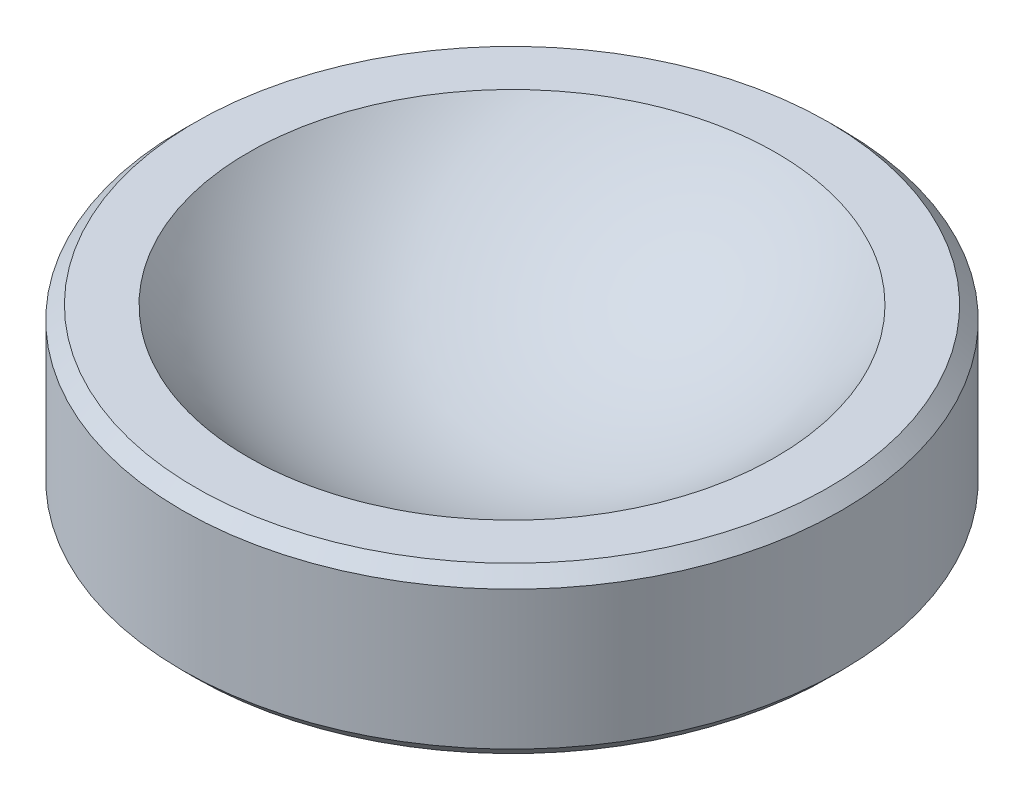
ISO-10303-21;
HEADER;
FILE_DESCRIPTION(('STEP AP214'),'2;1');
FILE_NAME('part.step','',(''),(''),'','','');
FILE_SCHEMA(('AUTOMOTIVE_DESIGN { 1 0 10303 214 1 1 1 1 }'));
ENDSEC;
DATA;
#1=APPLICATION_CONTEXT('core data for automotive mechanical design processes');
#2=APPLICATION_PROTOCOL_DEFINITION('international standard','automotive_design',2000,#1);
#3=PRODUCT_CONTEXT('',#1,'mechanical');
#4=PRODUCT('Part','Part','',(#3));
#5=PRODUCT_RELATED_PRODUCT_CATEGORY('part','',(#4));
#6=PRODUCT_DEFINITION_FORMATION('','',#4);
#7=PRODUCT_DEFINITION_CONTEXT('part definition',#1,'design');
#8=PRODUCT_DEFINITION('design','',#6,#7);
#9=PRODUCT_DEFINITION_SHAPE('','',#8);
#10=(LENGTH_UNIT() NAMED_UNIT(*) SI_UNIT(.MILLI.,.METRE.));
#11=(NAMED_UNIT(*) PLANE_ANGLE_UNIT() SI_UNIT($,.RADIAN.));
#12=(NAMED_UNIT(*) SI_UNIT($,.STERADIAN.) SOLID_ANGLE_UNIT());
#13=UNCERTAINTY_MEASURE_WITH_UNIT(LENGTH_MEASURE(1.E-05),#10,'distance_accuracy_value','');
#14=(GEOMETRIC_REPRESENTATION_CONTEXT(3) GLOBAL_UNCERTAINTY_ASSIGNED_CONTEXT((#13)) GLOBAL_UNIT_ASSIGNED_CONTEXT((#10,
#11,#12)) REPRESENTATION_CONTEXT('',''));
#15=CARTESIAN_POINT('',(0.,0.,0.));
#16=DIRECTION('',(0.,0.,1.));
#17=DIRECTION('',(1.,0.,0.));
#18=AXIS2_PLACEMENT_3D('',#15,#16,#17);
#19=CARTESIAN_POINT('',(0.,5.5,0.));
#20=DIRECTION('',(0.,0.,1.));
#21=DIRECTION('',(-1.,0.,0.));
#22=AXIS2_PLACEMENT_3D('',#19,#20,#21);
#23=SPHERICAL_SURFACE('',#22,5.);
#24=CARTESIAN_POINT('',(0.,2.5,4.));
#25=CARTESIAN_POINT('',(-0.112307455993672,2.5,3.99999932697811));
#26=CARTESIAN_POINT('',(-0.224635551516104,2.5,3.99526590948345));
#27=CARTESIAN_POINT('',(-0.448515486702258,2.5,3.97636301339049));
#28=CARTESIAN_POINT('',(-0.560067087363392,2.5,3.96219074897134));
#29=CARTESIAN_POINT('',(-0.781767626423731,2.5,3.92447392054895));
#30=CARTESIAN_POINT('',(-0.89191405044156,2.5,3.90091447908902));
#31=CARTESIAN_POINT('',(-1.10989190333024,2.5,3.84458569582454));
#32=CARTESIAN_POINT('',(-1.21772137681259,2.5,3.81180888012622));
#33=CARTESIAN_POINT('',(-1.53611761367653,2.5,3.70010552900731));
#34=CARTESIAN_POINT('',(-1.74212802744674,2.5,3.60771433820113));
#35=CARTESIAN_POINT('',(-2.13569072684822,2.5,3.38960812892643));
#36=CARTESIAN_POINT('',(-2.32324231043595,2.5,3.26389184367775));
#37=CARTESIAN_POINT('',(-2.58665072385949,2.5,3.05318566876178));
#38=CARTESIAN_POINT('',(-2.67151665455699,2.5,2.97920602232912));
#39=CARTESIAN_POINT('',(-2.83465616191807,2.5,2.82441878930258));
#40=CARTESIAN_POINT('',(-2.91293601571362,2.5,2.7436178546419));
#41=CARTESIAN_POINT('',(-3.06244481347264,2.5,2.57567006272378));
#42=CARTESIAN_POINT('',(-3.13367054736994,2.5,2.4885203473971));
#43=CARTESIAN_POINT('',(-3.26853430430056,2.5,2.30853844380074));
#44=CARTESIAN_POINT('',(-3.33217056611339,2.5,2.21570494408108));
#45=CARTESIAN_POINT('',(-3.51094243289427,2.5,1.92969101845484));
#46=CARTESIAN_POINT('',(-3.61409882935332,2.5,1.72881967762432));
#47=CARTESIAN_POINT('',(-3.78516122701828,2.5,1.31271786391941));
#48=CARTESIAN_POINT('',(-3.85306760471086,2.50000000000002,1.09748754443332));
#49=CARTESIAN_POINT('',(-3.95180065462839,2.50000000000002,0.658653524518329));
#50=CARTESIAN_POINT('',(-3.9826271288309,2.5,0.435049779378354));
#51=CARTESIAN_POINT('',(-4.00629338418573,2.5,-0.0141590136183445));
#52=CARTESIAN_POINT('',(-3.99913316533804,2.5,-0.239764061475068));
#53=CARTESIAN_POINT('',(-3.94705803928797,2.50000000000001,-0.686543306100016));
#54=CARTESIAN_POINT('',(-3.90214333370987,2.5,-0.907717526524202));
#55=CARTESIAN_POINT('',(-3.77575063725273,2.5,-1.33949055665196));
#56=CARTESIAN_POINT('',(-3.69427225585361,2.5,-1.55008925337644));
#57=CARTESIAN_POINT('',(-3.54654352875629,2.5,-1.85330463754199));
#58=CARTESIAN_POINT('',(-3.49301421377454,2.5,-1.95231092484382));
#59=CARTESIAN_POINT('',(-3.37780900225511,2.5,-2.14546753952315));
#60=CARTESIAN_POINT('',(-3.31613499499117,2.5,-2.23961898602684));
#61=CARTESIAN_POINT('',(-3.18510130830447,2.5,-2.42234696519481));
#62=CARTESIAN_POINT('',(-3.11574512149449,2.5,-2.51092600280232));
#63=CARTESIAN_POINT('',(-2.96977331196897,2.5,-2.68199855230653));
#64=CARTESIAN_POINT('',(-2.89315074790613,2.5,-2.7644861086765));
#65=CARTESIAN_POINT('',(-2.65334090438323,2.5,-3.00170399029497));
#66=CARTESIAN_POINT('',(-2.48003747466922,2.5,-3.14643167296954));
#67=CARTESIAN_POINT('',(-2.11157144039241,2.5,-3.40468484036285));
#68=CARTESIAN_POINT('',(-1.91640966709611,2.5,-3.51821151108036));
#69=CARTESIAN_POINT('',(-1.61151349140407,2.5,-3.66275259295221));
#70=CARTESIAN_POINT('',(-1.50772504020965,2.5,-3.70667835301924));
#71=CARTESIAN_POINT('',(-1.2968727501032,2.5,-3.78559975652223));
#72=CARTESIAN_POINT('',(-1.18981164108889,2.5,-3.82060262701088));
#73=CARTESIAN_POINT('',(-0.97330158553364,2.5,-3.88140627829392));
#74=CARTESIAN_POINT('',(-0.863856702732686,2.5,-3.90722158998123));
#75=CARTESIAN_POINT('',(-0.643202405082377,2.5,-3.94954446545191));
#76=CARTESIAN_POINT('',(-0.531993520638112,2.5,-3.96605477452042));
#77=CARTESIAN_POINT('',(-0.350510226378846,2.5,-3.98523174378681));
#78=CARTESIAN_POINT('',(-0.280526384155132,2.5,-3.99076808730425));
#79=CARTESIAN_POINT('',(-0.140364381604855,2.5,-3.99815242571239));
#80=CARTESIAN_POINT('',(-0.0701862212782931,2.5,-4.00000042060309));
#81=CARTESIAN_POINT('',(0.112307455993671,2.5,-3.99999932697811));
#82=CARTESIAN_POINT('',(0.224635551516103,2.5,-3.99526590948345));
#83=CARTESIAN_POINT('',(0.448515486702258,2.5,-3.97636301339049));
#84=CARTESIAN_POINT('',(0.560067087363392,2.5,-3.96219074897134));
#85=CARTESIAN_POINT('',(0.781767626423731,2.5,-3.92447392054895));
#86=CARTESIAN_POINT('',(0.89191405044156,2.5,-3.90091447908902));
#87=CARTESIAN_POINT('',(1.10989190333024,2.5,-3.84458569582454));
#88=CARTESIAN_POINT('',(1.21772137681259,2.5,-3.81180888012622));
#89=CARTESIAN_POINT('',(1.53611761367653,2.5,-3.70010552900731));
#90=CARTESIAN_POINT('',(1.74212802744674,2.5,-3.60771433820113));
#91=CARTESIAN_POINT('',(2.13569072684822,2.5,-3.38960812892643));
#92=CARTESIAN_POINT('',(2.32324231043595,2.5,-3.26389184367775));
#93=CARTESIAN_POINT('',(2.58665072385949,2.5,-3.05318566876178));
#94=CARTESIAN_POINT('',(2.67151665455699,2.5,-2.97920602232912));
#95=CARTESIAN_POINT('',(2.83465616191807,2.5,-2.82441878930258));
#96=CARTESIAN_POINT('',(2.91293601571362,2.5,-2.7436178546419));
#97=CARTESIAN_POINT('',(3.06244481347263,2.5,-2.57567006272378));
#98=CARTESIAN_POINT('',(3.13367054736994,2.5,-2.4885203473971));
#99=CARTESIAN_POINT('',(3.26853430430056,2.5,-2.30853844380074));
#100=CARTESIAN_POINT('',(3.33217056611339,2.5,-2.21570494408108));
#101=CARTESIAN_POINT('',(3.51094243289427,2.5,-1.92969101845485));
#102=CARTESIAN_POINT('',(3.61409882935332,2.5,-1.72881967762433));
#103=CARTESIAN_POINT('',(3.78516122701828,2.5,-1.31271786391941));
#104=CARTESIAN_POINT('',(3.85306760471086,2.50000000000002,-1.09748754443332));
#105=CARTESIAN_POINT('',(3.95180065462839,2.50000000000002,-0.658653524518328));
#106=CARTESIAN_POINT('',(3.9826271288309,2.5,-0.435049779378353));
#107=CARTESIAN_POINT('',(4.00629338418573,2.5,0.0141590136183452));
#108=CARTESIAN_POINT('',(3.99913316533804,2.5,0.239764061475069));
#109=CARTESIAN_POINT('',(3.94705803928797,2.50000000000001,0.686543306100017));
#110=CARTESIAN_POINT('',(3.90214333370987,2.5,0.907717526524202));
#111=CARTESIAN_POINT('',(3.77575063725273,2.5,1.33949055665196));
#112=CARTESIAN_POINT('',(3.69427225585362,2.5,1.55008925337644));
#113=CARTESIAN_POINT('',(3.54654352875629,2.5,1.85330463754199));
#114=CARTESIAN_POINT('',(3.49301421377454,2.5,1.95231092484382));
#115=CARTESIAN_POINT('',(3.37780900225511,2.5,2.14546753952315));
#116=CARTESIAN_POINT('',(3.31613499499117,2.5,2.23961898602684));
#117=CARTESIAN_POINT('',(3.18510130830447,2.5,2.42234696519481));
#118=CARTESIAN_POINT('',(3.11574512149449,2.5,2.51092600280232));
#119=CARTESIAN_POINT('',(2.96977331196897,2.5,2.68199855230653));
#120=CARTESIAN_POINT('',(2.89315074790613,2.5,2.7644861086765));
#121=CARTESIAN_POINT('',(2.65334090438323,2.5,3.00170399029497));
#122=CARTESIAN_POINT('',(2.48003747466922,2.5,3.14643167296954));
#123=CARTESIAN_POINT('',(2.11157144039241,2.5,3.40468484036285));
#124=CARTESIAN_POINT('',(1.91640966709611,2.5,3.51821151108036));
#125=CARTESIAN_POINT('',(1.61151349140407,2.5,3.66275259295221));
#126=CARTESIAN_POINT('',(1.50772504020965,2.5,3.70667835301924));
#127=CARTESIAN_POINT('',(1.2968727501032,2.5,3.78559975652223));
#128=CARTESIAN_POINT('',(1.18981164108889,2.5,3.82060262701088));
#129=CARTESIAN_POINT('',(0.97330158553364,2.5,3.88140627829393));
#130=CARTESIAN_POINT('',(0.863856702732686,2.5,3.90722158998123));
#131=CARTESIAN_POINT('',(0.643202405082377,2.5,3.94954446545191));
#132=CARTESIAN_POINT('',(0.531993520638112,2.5,3.96605477452042));
#133=CARTESIAN_POINT('',(0.350510226378845,2.5,3.98523174378681));
#134=CARTESIAN_POINT('',(0.280526384155131,2.5,3.99076808730425));
#135=CARTESIAN_POINT('',(0.140364381604855,2.5,3.99815242571239));
#136=CARTESIAN_POINT('',(0.0701862212782923,2.5,4.00000042060309));
#137=CARTESIAN_POINT('',(0.,2.5,4.));
#138=B_SPLINE_CURVE_WITH_KNOTS('',3,(#24,#25,#26,#27,#28,#29,#30,#31,#32,#33,#34,#35,#36,#37,
#38,#39,#40,#41,#42,#43,#44,#45,#46,#47,#48,#49,#50,#51,#52,#53,#54,#55,#56,#57,#58,#59,#60,#61,
#62,#63,#64,#65,#66,#67,#68,#69,#70,#71,#72,#73,#74,#75,#76,#77,#78,#79,#80,#81,#82,#83,#84,#85,
#86,#87,#88,#89,#90,#91,#92,#93,#94,#95,#96,#97,#98,#99,#100,#101,#102,#103,#104,#105,#106,#107,
#108,#109,#110,#111,#112,#113,#114,#115,#116,#117,#118,#119,#120,#121,#122,#123,#124,#125,#126,
#127,#128,#129,#130,#131,#132,#133,#134,#135,#136,#137),.UNSPECIFIED.,.T.,.F.,(4,2,2,2,2,2,2,2,
2,2,2,2,2,2,2,2,2,2,2,2,2,2,2,2,2,2,2,2,2,2,2,2,2,2,2,2,2,2,2,2,2,2,2,2,2,2,2,2,2,2,2,2,2,2,2,2,
4),(0.,0.336857754912116,0.673814975518885,1.01130836738975,1.34907620824365,2.02300179055887,
2.69695299434703,3.0343701601673,3.37146200501947,3.70870654965058,4.04602920393358,
4.71997119606786,5.39390599003854,6.06784438309111,6.74178277614368,7.41571757011438,
8.08965956224867,8.42698221653167,8.76422676116278,9.10131860601495,9.43873577183521,
10.1126869756234,10.7866125579386,11.1243803987925,11.4618737906634,11.7988310112701,
12.1356887661822,12.3462070502657,12.5567253343492,12.8935830892614,13.2305403098681,
13.568033701739,13.9058015425929,14.5797271249081,15.2536783286963,15.5910954945165,
15.9281873393687,16.2654318839998,16.6027545382828,17.2766965304171,17.9506313243878,
18.6245697174404,19.2985081104929,19.9724429044636,20.6463848965979,20.9837075508809,
21.320952095512,21.6580439403642,21.9954611061845,22.6694123099726,23.3433378922878,
23.6811057331417,24.0185991250126,24.3555563456194,24.6924141005315,24.902932384615,
25.1134506686985),.UNSPECIFIED.);
#139=CARTESIAN_POINT('',(0.,2.5,4.));
#140=VERTEX_POINT('',#139);
#141=EDGE_CURVE('E20',#140,#140,#138,.T.);
#142=ORIENTED_EDGE('',*,*,#141,.F.);
#143=EDGE_LOOP('',(#142));
#144=FACE_BOUND('',#143,.T.);
#145=ADVANCED_FACE('F15',(#144),#23,.F.);
#146=CARTESIAN_POINT('',(0.,2.5,0.));
#147=DIRECTION('',(0.,1.,0.));
#148=DIRECTION('',(0.,0.,1.));
#149=AXIS2_PLACEMENT_3D('',#146,#147,#148);
#150=PLANE('',#149);
#151=ORIENTED_EDGE('',*,*,#141,.T.);
#152=EDGE_LOOP('',(#151));
#153=FACE_BOUND('',#152,.T.);
#154=CARTESIAN_POINT('',(0.,2.49999999994088,0.));
#155=DIRECTION('',(0.,-1.,0.));
#156=DIRECTION('',(0.,0.,-1.));
#157=AXIS2_PLACEMENT_3D('',#154,#155,#156);
#158=CIRCLE('',#157,4.80000000004566);
#159=CARTESIAN_POINT('',(0.,2.49999999994088,-4.80000000004566));
#160=VERTEX_POINT('',#159);
#161=EDGE_CURVE('E36',#160,#160,#158,.T.);
#162=ORIENTED_EDGE('',*,*,#161,.F.);
#163=EDGE_LOOP('',(#162));
#164=FACE_BOUND('',#163,.T.);
#165=ADVANCED_FACE('F44',(#153,#164),#150,.T.);
#166=CARTESIAN_POINT('',(0.,2.29999999999109,0.));
#167=DIRECTION('',(0.,-1.,0.));
#168=DIRECTION('',(0.,0.,-1.));
#169=AXIS2_PLACEMENT_3D('',#166,#167,#168);
#170=CONICAL_SURFACE('',#169,4.99999999999545,0.785398163397448);
#171=CARTESIAN_POINT('',(0.,2.3,0.));
#172=DIRECTION('',(0.,1.,0.));
#173=DIRECTION('',(0.,0.,1.));
#174=AXIS2_PLACEMENT_3D('',#171,#172,#173);
#175=CIRCLE('',#174,5.);
#176=CARTESIAN_POINT('',(0.,2.3,5.));
#177=VERTEX_POINT('',#176);
#178=EDGE_CURVE('E32',#177,#177,#175,.F.);
#179=ORIENTED_EDGE('',*,*,#178,.F.);
#180=EDGE_LOOP('',(#179));
#181=FACE_BOUND('',#180,.T.);
#182=ORIENTED_EDGE('',*,*,#161,.T.);
#183=EDGE_LOOP('',(#182));
#184=FACE_BOUND('',#183,.T.);
#185=ADVANCED_FACE('F52',(#181,#184),#170,.T.);
#186=CARTESIAN_POINT('',(0.,0.,0.));
#187=DIRECTION('',(0.,1.,0.));
#188=DIRECTION('',(0.,0.,1.));
#189=AXIS2_PLACEMENT_3D('',#186,#187,#188);
#190=CYLINDRICAL_SURFACE('',#189,5.);
#191=CARTESIAN_POINT('',(0.,0.200000000006639,0.));
#192=DIRECTION('',(0.,1.,0.));
#193=DIRECTION('',(0.,0.,-1.));
#194=AXIS2_PLACEMENT_3D('',#191,#192,#193);
#195=CIRCLE('',#194,4.99999999999545);
#196=CARTESIAN_POINT('',(0.,0.200000000006639,-4.99999999999545));
#197=VERTEX_POINT('',#196);
#198=EDGE_CURVE('E27',#197,#197,#195,.F.);
#199=ORIENTED_EDGE('',*,*,#198,.F.);
#200=EDGE_LOOP('',(#199));
#201=FACE_BOUND('',#200,.T.);
#202=ORIENTED_EDGE('',*,*,#178,.T.);
#203=EDGE_LOOP('',(#202));
#204=FACE_BOUND('',#203,.T.);
#205=ADVANCED_FACE('F61',(#201,#204),#190,.T.);
#206=CARTESIAN_POINT('',(0.,0.200000000006639,0.));
#207=DIRECTION('',(0.,1.,0.));
#208=DIRECTION('',(0.,0.,1.));
#209=AXIS2_PLACEMENT_3D('',#206,#207,#208);
#210=CONICAL_SURFACE('',#209,4.99999999999545,0.785398163397448);
#211=ORIENTED_EDGE('',*,*,#198,.T.);
#212=EDGE_LOOP('',(#211));
#213=FACE_BOUND('',#212,.T.);
#214=CARTESIAN_POINT('',(0.,5.68581640103538E-11,0.));
#215=DIRECTION('',(0.,1.,0.));
#216=DIRECTION('',(0.,0.,1.));
#217=AXIS2_PLACEMENT_3D('',#214,#215,#216);
#218=CIRCLE('',#217,4.80000000004566);
#219=CARTESIAN_POINT('',(0.,5.68581640103538E-11,4.80000000004564));
#220=VERTEX_POINT('',#219);
#221=EDGE_CURVE('E10',#220,#220,#218,.T.);
#222=ORIENTED_EDGE('',*,*,#221,.T.);
#223=EDGE_LOOP('',(#222));
#224=FACE_BOUND('',#223,.T.);
#225=ADVANCED_FACE('F55',(#213,#224),#210,.T.);
#226=CARTESIAN_POINT('',(0.,0.,0.));
#227=DIRECTION('',(0.,1.,0.));
#228=DIRECTION('',(0.,0.,1.));
#229=AXIS2_PLACEMENT_3D('',#226,#227,#228);
#230=PLANE('',#229);
#231=ORIENTED_EDGE('',*,*,#221,.F.);
#232=EDGE_LOOP('',(#231));
#233=FACE_BOUND('',#232,.T.);
#234=ADVANCED_FACE('F53',(#233),#230,.F.);
#235=CLOSED_SHELL('',(#145,#165,#185,#205,#225,#234));
#236=MANIFOLD_SOLID_BREP('B1',#235);
#237=ADVANCED_BREP_SHAPE_REPRESENTATION('',(#18,#236),#14);
#238=SHAPE_DEFINITION_REPRESENTATION(#9,#237);
ENDSEC;
END-ISO-10303-21;
